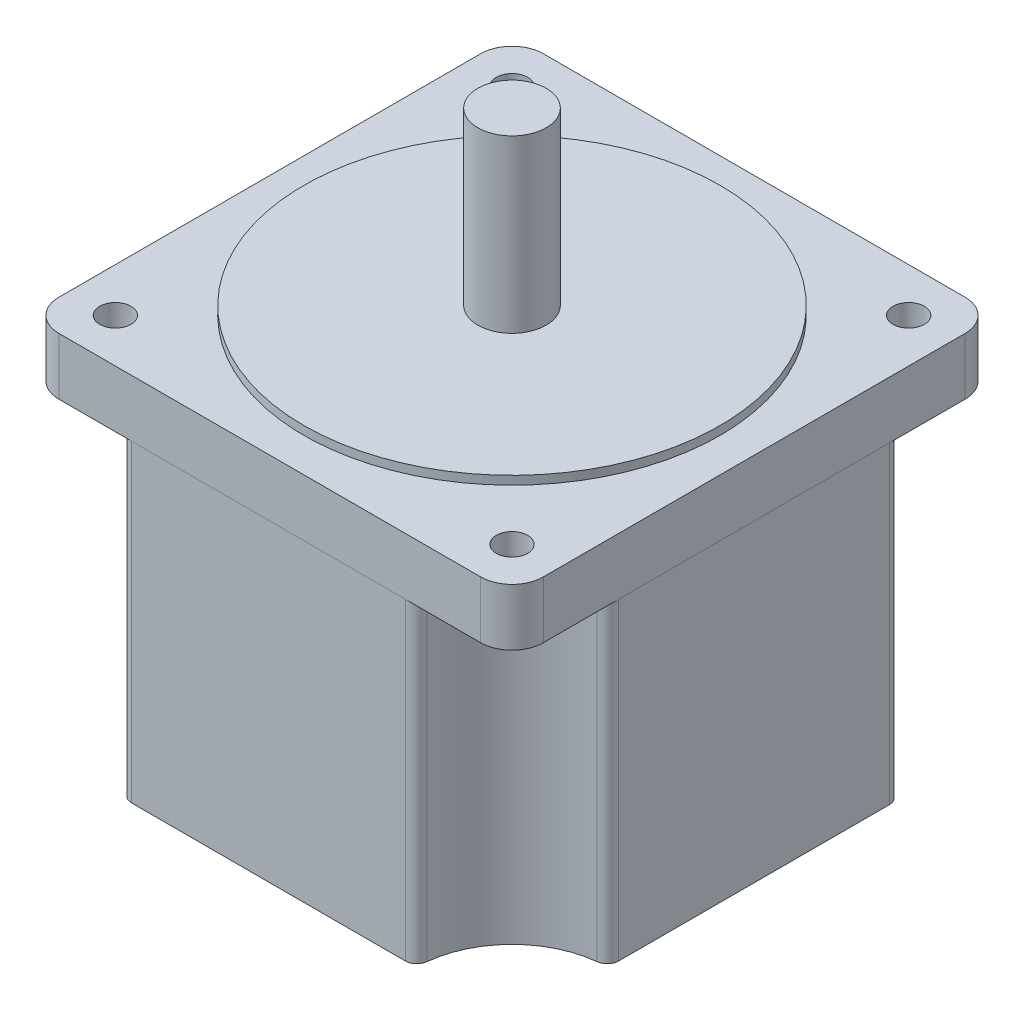
ISO-10303-21;
HEADER;
FILE_DESCRIPTION(('STEP AP214'),'2;1');
FILE_NAME('part.step','',(''),(''),'','','');
FILE_SCHEMA(('AUTOMOTIVE_DESIGN { 1 0 10303 214 1 1 1 1 }'));
ENDSEC;
DATA;
#1=APPLICATION_CONTEXT('core data for automotive mechanical design processes');
#2=APPLICATION_PROTOCOL_DEFINITION('international standard','automotive_design',2000,#1);
#3=PRODUCT_CONTEXT('',#1,'mechanical');
#4=PRODUCT('Part','Part','',(#3));
#5=PRODUCT_RELATED_PRODUCT_CATEGORY('part','',(#4));
#6=PRODUCT_DEFINITION_FORMATION('','',#4);
#7=PRODUCT_DEFINITION_CONTEXT('part definition',#1,'design');
#8=PRODUCT_DEFINITION('design','',#6,#7);
#9=PRODUCT_DEFINITION_SHAPE('','',#8);
#10=(LENGTH_UNIT() NAMED_UNIT(*) SI_UNIT(.MILLI.,.METRE.));
#11=(NAMED_UNIT(*) PLANE_ANGLE_UNIT() SI_UNIT($,.RADIAN.));
#12=(NAMED_UNIT(*) SI_UNIT($,.STERADIAN.) SOLID_ANGLE_UNIT());
#13=UNCERTAINTY_MEASURE_WITH_UNIT(LENGTH_MEASURE(1.E-05),#10,'distance_accuracy_value','');
#14=(GEOMETRIC_REPRESENTATION_CONTEXT(3) GLOBAL_UNCERTAINTY_ASSIGNED_CONTEXT((#13)) GLOBAL_UNIT_ASSIGNED_CONTEXT((#10,
#11,#12)) REPRESENTATION_CONTEXT('',''));
#15=CARTESIAN_POINT('',(0.,0.,0.));
#16=DIRECTION('',(0.,0.,1.));
#17=DIRECTION('',(1.,0.,0.));
#18=AXIS2_PLACEMENT_3D('',#15,#16,#17);
#19=CARTESIAN_POINT('',(0.,11.5,0.));
#20=DIRECTION('',(0.,1.,0.));
#21=DIRECTION('',(0.,0.,1.));
#22=AXIS2_PLACEMENT_3D('',#19,#20,#21);
#23=PLANE('',#22);
#24=CARTESIAN_POINT('',(0.,11.5,0.));
#25=DIRECTION('',(0.,1.,0.));
#26=DIRECTION('',(0.,0.,1.));
#27=AXIS2_PLACEMENT_3D('',#24,#25,#26);
#28=CIRCLE('',#27,36.51);
#29=CARTESIAN_POINT('',(0.,11.5,36.51));
#30=VERTEX_POINT('',#29);
#31=EDGE_CURVE('E229',#30,#30,#28,.T.);
#32=ORIENTED_EDGE('',*,*,#31,.T.);
#33=EDGE_LOOP('',(#32));
#34=FACE_BOUND('',#33,.T.);
#35=CARTESIAN_POINT('',(0.,11.5,0.));
#36=DIRECTION('',(0.,1.,0.));
#37=DIRECTION('',(0.,0.,1.));
#38=AXIS2_PLACEMENT_3D('',#35,#36,#37);
#39=CIRCLE('',#38,6.);
#40=CARTESIAN_POINT('',(0.,11.5,6.));
#41=VERTEX_POINT('',#40);
#42=EDGE_CURVE('E219',#41,#41,#39,.T.);
#43=ORIENTED_EDGE('',*,*,#42,.F.);
#44=EDGE_LOOP('',(#43));
#45=FACE_BOUND('',#44,.T.);
#46=ADVANCED_FACE('F31',(#34,#45),#23,.T.);
#47=CARTESIAN_POINT('',(-37.,10.,-37.));
#48=DIRECTION('',(0.,-1.,0.));
#49=DIRECTION('',(0.,0.,-1.));
#50=AXIS2_PLACEMENT_3D('',#47,#48,#49);
#51=PLANE('',#50);
#52=CARTESIAN_POINT('',(-34.8,10.,34.8));
#53=DIRECTION('',(0.,1.,0.));
#54=DIRECTION('',(0.,0.,-1.));
#55=AXIS2_PLACEMENT_3D('',#52,#53,#54);
#56=CIRCLE('',#55,2.75);
#57=CARTESIAN_POINT('',(-34.8,10.,32.05));
#58=VERTEX_POINT('',#57);
#59=EDGE_CURVE('E234',#58,#58,#56,.T.);
#60=ORIENTED_EDGE('',*,*,#59,.F.);
#61=EDGE_LOOP('',(#60));
#62=FACE_BOUND('',#61,.T.);
#63=CARTESIAN_POINT('',(34.8,10.,-34.8));
#64=DIRECTION('',(0.,1.,0.));
#65=DIRECTION('',(0.,0.,-1.));
#66=AXIS2_PLACEMENT_3D('',#63,#64,#65);
#67=CIRCLE('',#66,2.75);
#68=CARTESIAN_POINT('',(34.8,10.,-37.55));
#69=VERTEX_POINT('',#68);
#70=EDGE_CURVE('E246',#69,#69,#67,.T.);
#71=ORIENTED_EDGE('',*,*,#70,.F.);
#72=EDGE_LOOP('',(#71));
#73=FACE_BOUND('',#72,.T.);
#74=CARTESIAN_POINT('',(-37.,10.,-37.));
#75=DIRECTION('',(0.,1.,0.));
#76=DIRECTION('',(0.,0.,-1.));
#77=AXIS2_PLACEMENT_3D('',#74,#75,#76);
#78=CIRCLE('',#77,5.5);
#79=CARTESIAN_POINT('',(-37.,10.,-42.5));
#80=VERTEX_POINT('',#79);
#81=CARTESIAN_POINT('',(-42.5,10.,-37.));
#82=VERTEX_POINT('',#81);
#83=EDGE_CURVE('E258',#80,#82,#78,.T.);
#84=ORIENTED_EDGE('',*,*,#83,.T.);
#85=DIRECTION('',(0.,0.,1.));
#86=VECTOR('',#85,1.);
#87=CARTESIAN_POINT('',(-42.5,10.,-37.));
#88=LINE('',#87,#86);
#89=CARTESIAN_POINT('',(-42.5,10.,37.));
#90=VERTEX_POINT('',#89);
#91=EDGE_CURVE('E261',#82,#90,#88,.T.);
#92=ORIENTED_EDGE('',*,*,#91,.T.);
#93=CARTESIAN_POINT('',(-37.,10.,37.));
#94=DIRECTION('',(0.,1.,0.));
#95=DIRECTION('',(0.,0.,1.));
#96=AXIS2_PLACEMENT_3D('',#93,#94,#95);
#97=CIRCLE('',#96,5.5);
#98=CARTESIAN_POINT('',(-37.,10.,42.5));
#99=VERTEX_POINT('',#98);
#100=EDGE_CURVE('E264',#90,#99,#97,.T.);
#101=ORIENTED_EDGE('',*,*,#100,.T.);
#102=DIRECTION('',(1.,0.,0.));
#103=VECTOR('',#102,1.);
#104=CARTESIAN_POINT('',(-37.,10.,42.5));
#105=LINE('',#104,#103);
#106=CARTESIAN_POINT('',(37.,10.,42.5));
#107=VERTEX_POINT('',#106);
#108=EDGE_CURVE('E266',#99,#107,#105,.T.);
#109=ORIENTED_EDGE('',*,*,#108,.T.);
#110=CARTESIAN_POINT('',(37.,10.,37.));
#111=DIRECTION('',(0.,1.,0.));
#112=DIRECTION('',(0.,0.,1.));
#113=AXIS2_PLACEMENT_3D('',#110,#111,#112);
#114=CIRCLE('',#113,5.5);
#115=CARTESIAN_POINT('',(42.5,10.,37.));
#116=VERTEX_POINT('',#115);
#117=EDGE_CURVE('E268',#107,#116,#114,.T.);
#118=ORIENTED_EDGE('',*,*,#117,.T.);
#119=DIRECTION('',(0.,0.,-1.));
#120=VECTOR('',#119,1.);
#121=CARTESIAN_POINT('',(42.5,10.,-37.));
#122=LINE('',#121,#120);
#123=CARTESIAN_POINT('',(42.5,10.,-37.));
#124=VERTEX_POINT('',#123);
#125=EDGE_CURVE('E270',#116,#124,#122,.T.);
#126=ORIENTED_EDGE('',*,*,#125,.T.);
#127=CARTESIAN_POINT('',(37.,10.,-37.));
#128=DIRECTION('',(0.,1.,0.));
#129=DIRECTION('',(0.,0.,1.));
#130=AXIS2_PLACEMENT_3D('',#127,#128,#129);
#131=CIRCLE('',#130,5.5);
#132=CARTESIAN_POINT('',(37.,10.,-42.5));
#133=VERTEX_POINT('',#132);
#134=EDGE_CURVE('E272',#124,#133,#131,.T.);
#135=ORIENTED_EDGE('',*,*,#134,.T.);
#136=DIRECTION('',(-1.,0.,0.));
#137=VECTOR('',#136,1.);
#138=CARTESIAN_POINT('',(-37.,10.,-42.5));
#139=LINE('',#138,#137);
#140=EDGE_CURVE('E274',#133,#80,#139,.T.);
#141=ORIENTED_EDGE('',*,*,#140,.T.);
#142=EDGE_LOOP('',(#84,#92,#101,#109,#118,#126,#135,#141));
#143=FACE_BOUND('',#142,.T.);
#144=CARTESIAN_POINT('',(-34.8,10.,-34.8));
#145=DIRECTION('',(0.,1.,0.));
#146=DIRECTION('',(0.,0.,1.));
#147=AXIS2_PLACEMENT_3D('',#144,#145,#146);
#148=CIRCLE('',#147,2.75);
#149=CARTESIAN_POINT('',(-34.8,10.,-32.05));
#150=VERTEX_POINT('',#149);
#151=EDGE_CURVE('E252',#150,#150,#148,.T.);
#152=ORIENTED_EDGE('',*,*,#151,.F.);
#153=EDGE_LOOP('',(#152));
#154=FACE_BOUND('',#153,.T.);
#155=CARTESIAN_POINT('',(34.8,10.,34.8));
#156=DIRECTION('',(0.,1.,0.));
#157=DIRECTION('',(0.,0.,1.));
#158=AXIS2_PLACEMENT_3D('',#155,#156,#157);
#159=CIRCLE('',#158,2.75);
#160=CARTESIAN_POINT('',(34.8,10.,37.55));
#161=VERTEX_POINT('',#160);
#162=EDGE_CURVE('E240',#161,#161,#159,.T.);
#163=ORIENTED_EDGE('',*,*,#162,.F.);
#164=EDGE_LOOP('',(#163));
#165=FACE_BOUND('',#164,.T.);
#166=CARTESIAN_POINT('',(0.,10.,0.));
#167=DIRECTION('',(0.,-1.,0.));
#168=DIRECTION('',(0.,0.,-1.));
#169=AXIS2_PLACEMENT_3D('',#166,#167,#168);
#170=CIRCLE('',#169,36.51);
#171=CARTESIAN_POINT('',(0.,10.,-36.51));
#172=VERTEX_POINT('',#171);
#173=EDGE_CURVE('E35',#172,#172,#170,.F.);
#174=ORIENTED_EDGE('',*,*,#173,.F.);
#175=EDGE_LOOP('',(#174));
#176=FACE_BOUND('',#175,.T.);
#177=ADVANCED_FACE('F323',(#62,#73,#143,#154,#165,#176),#51,.F.);
#178=CARTESIAN_POINT('',(-37.,0.,-37.));
#179=DIRECTION('',(0.,-1.,0.));
#180=DIRECTION('',(0.,0.,-1.));
#181=AXIS2_PLACEMENT_3D('',#178,#179,#180);
#182=PLANE('',#181);
#183=CARTESIAN_POINT('',(-40.7551346354381,0.,-23.986897934833));
#184=DIRECTION('',(0.,-1.,0.));
#185=DIRECTION('',(0.,0.,1.));
#186=AXIS2_PLACEMENT_3D('',#183,#184,#185);
#187=CIRCLE('',#186,2.);
#188=CARTESIAN_POINT('',(-42.5,0.,-24.964366532565));
#189=VERTEX_POINT('',#188);
#190=CARTESIAN_POINT('',(-40.9702650079219,0.,-25.9752940027317));
#191=VERTEX_POINT('',#190);
#192=EDGE_CURVE('E11',#189,#191,#187,.T.);
#193=ORIENTED_EDGE('',*,*,#192,.F.);
#194=DIRECTION('',(0.,0.,1.));
#195=VECTOR('',#194,1.);
#196=CARTESIAN_POINT('',(-42.5,0.,-37.));
#197=LINE('',#196,#195);
#198=CARTESIAN_POINT('',(-42.5,0.,-37.));
#199=VERTEX_POINT('',#198);
#200=EDGE_CURVE('E280',#199,#189,#197,.T.);
#201=ORIENTED_EDGE('',*,*,#200,.F.);
#202=CARTESIAN_POINT('',(-37.,0.,-37.));
#203=DIRECTION('',(0.,1.,0.));
#204=DIRECTION('',(0.,0.,-1.));
#205=AXIS2_PLACEMENT_3D('',#202,#203,#204);
#206=CIRCLE('',#205,5.5);
#207=CARTESIAN_POINT('',(-37.,0.,-42.5));
#208=VERTEX_POINT('',#207);
#209=EDGE_CURVE('E255',#208,#199,#206,.T.);
#210=ORIENTED_EDGE('',*,*,#209,.F.);
#211=DIRECTION('',(-1.,0.,0.));
#212=VECTOR('',#211,1.);
#213=CARTESIAN_POINT('',(-37.,0.,-42.5));
#214=LINE('',#213,#212);
#215=CARTESIAN_POINT('',(37.,0.,-42.5));
#216=VERTEX_POINT('',#215);
#217=EDGE_CURVE('E262',#216,#208,#214,.T.);
#218=ORIENTED_EDGE('',*,*,#217,.F.);
#219=CARTESIAN_POINT('',(37.,0.,-37.));
#220=DIRECTION('',(0.,1.,0.));
#221=DIRECTION('',(0.,0.,1.));
#222=AXIS2_PLACEMENT_3D('',#219,#220,#221);
#223=CIRCLE('',#222,5.5);
#224=CARTESIAN_POINT('',(42.5,0.,-37.));
#225=VERTEX_POINT('',#224);
#226=EDGE_CURVE('E292',#225,#216,#223,.T.);
#227=ORIENTED_EDGE('',*,*,#226,.F.);
#228=DIRECTION('',(0.,0.,-1.));
#229=VECTOR('',#228,1.);
#230=CARTESIAN_POINT('',(42.5,0.,-37.));
#231=LINE('',#230,#229);
#232=CARTESIAN_POINT('',(42.5,0.,37.));
#233=VERTEX_POINT('',#232);
#234=EDGE_CURVE('E290',#233,#225,#231,.T.);
#235=ORIENTED_EDGE('',*,*,#234,.F.);
#236=CARTESIAN_POINT('',(37.,0.,37.));
#237=DIRECTION('',(0.,1.,0.));
#238=DIRECTION('',(0.,0.,1.));
#239=AXIS2_PLACEMENT_3D('',#236,#237,#238);
#240=CIRCLE('',#239,5.5);
#241=CARTESIAN_POINT('',(37.,0.,42.5));
#242=VERTEX_POINT('',#241);
#243=EDGE_CURVE('E288',#242,#233,#240,.T.);
#244=ORIENTED_EDGE('',*,*,#243,.F.);
#245=DIRECTION('',(1.,0.,0.));
#246=VECTOR('',#245,1.);
#247=CARTESIAN_POINT('',(-37.,0.,42.5));
#248=LINE('',#247,#246);
#249=CARTESIAN_POINT('',(-37.,0.,42.5));
#250=VERTEX_POINT('',#249);
#251=EDGE_CURVE('E286',#250,#242,#248,.T.);
#252=ORIENTED_EDGE('',*,*,#251,.F.);
#253=CARTESIAN_POINT('',(-37.,0.,37.));
#254=DIRECTION('',(0.,1.,0.));
#255=DIRECTION('',(0.,0.,1.));
#256=AXIS2_PLACEMENT_3D('',#253,#254,#255);
#257=CIRCLE('',#256,5.5);
#258=CARTESIAN_POINT('',(-42.5,0.,37.));
#259=VERTEX_POINT('',#258);
#260=EDGE_CURVE('E283',#259,#250,#257,.T.);
#261=ORIENTED_EDGE('',*,*,#260,.F.);
#262=CARTESIAN_POINT('',(-42.5,0.,24.9643665325649));
#263=VERTEX_POINT('',#262);
#264=EDGE_CURVE('E279',#263,#259,#197,.T.);
#265=ORIENTED_EDGE('',*,*,#264,.F.);
#266=CARTESIAN_POINT('',(-40.7551346354381,0.,23.986897934833));
#267=DIRECTION('',(0.,-1.,0.));
#268=DIRECTION('',(0.,0.,-1.));
#269=AXIS2_PLACEMENT_3D('',#266,#267,#268);
#270=CIRCLE('',#269,2.);
#271=CARTESIAN_POINT('',(-40.9702650079219,0.,25.9752940027317));
#272=VERTEX_POINT('',#271);
#273=EDGE_CURVE('E394',#272,#263,#270,.T.);
#274=ORIENTED_EDGE('',*,*,#273,.F.);
#275=CARTESIAN_POINT('',(-42.755134635438,0.,42.4723962393402));
#276=DIRECTION('',(0.,1.,0.));
#277=DIRECTION('',(0.,0.,1.));
#278=AXIS2_PLACEMENT_3D('',#275,#276,#277);
#279=CIRCLE('',#278,16.5933764433988);
#280=CARTESIAN_POINT('',(-26.2580323988295,0.,40.6875266118239));
#281=VERTEX_POINT('',#280);
#282=EDGE_CURVE('E472',#281,#272,#279,.T.);
#283=ORIENTED_EDGE('',*,*,#282,.F.);
#284=CARTESIAN_POINT('',(-24.2696363309308,0.,40.4723962393401));
#285=DIRECTION('',(0.,-1.,0.));
#286=DIRECTION('',(0.,0.,-1.));
#287=AXIS2_PLACEMENT_3D('',#284,#285,#286);
#288=CIRCLE('',#287,2.);
#289=CARTESIAN_POINT('',(-24.2696363309308,0.,42.4723962393401));
#290=VERTEX_POINT('',#289);
#291=EDGE_CURVE('E469',#290,#281,#288,.T.);
#292=ORIENTED_EDGE('',*,*,#291,.F.);
#293=DIRECTION('',(-1.,0.,0.));
#294=VECTOR('',#293,1.);
#295=CARTESIAN_POINT('',(-24.2696363309308,0.,42.4723962393401));
#296=LINE('',#295,#294);
#297=CARTESIAN_POINT('',(23.7593670600548,0.,42.4723962393401));
#298=VERTEX_POINT('',#297);
#299=EDGE_CURVE('E466',#298,#290,#296,.T.);
#300=ORIENTED_EDGE('',*,*,#299,.F.);
#301=CARTESIAN_POINT('',(23.7593670600548,0.,40.4723962393401));
#302=DIRECTION('',(0.,-1.,0.));
#303=DIRECTION('',(0.,0.,-1.));
#304=AXIS2_PLACEMENT_3D('',#301,#302,#303);
#305=CIRCLE('',#304,2.);
#306=CARTESIAN_POINT('',(25.7477631279535,0.,40.6875266118239));
#307=VERTEX_POINT('',#306);
#308=EDGE_CURVE('E463',#307,#298,#305,.T.);
#309=ORIENTED_EDGE('',*,*,#308,.F.);
#310=CARTESIAN_POINT('',(42.5,0.,42.5));
#311=DIRECTION('',(0.,1.,0.));
#312=DIRECTION('',(0.,0.,1.));
#313=AXIS2_PLACEMENT_3D('',#310,#311,#312);
#314=CIRCLE('',#313,16.85);
#315=CARTESIAN_POINT('',(40.6875266118239,0.,25.7477631279535));
#316=VERTEX_POINT('',#315);
#317=EDGE_CURVE('E460',#316,#307,#314,.T.);
#318=ORIENTED_EDGE('',*,*,#317,.F.);
#319=CARTESIAN_POINT('',(40.4723962393401,0.,23.7593670600548));
#320=DIRECTION('',(0.,-1.,0.));
#321=DIRECTION('',(0.,0.,-1.));
#322=AXIS2_PLACEMENT_3D('',#319,#320,#321);
#323=CIRCLE('',#322,2.);
#324=CARTESIAN_POINT('',(42.4723962393401,0.,23.7593670600548));
#325=VERTEX_POINT('',#324);
#326=EDGE_CURVE('E457',#325,#316,#323,.T.);
#327=ORIENTED_EDGE('',*,*,#326,.F.);
#328=DIRECTION('',(0.,0.,1.));
#329=VECTOR('',#328,1.);
#330=CARTESIAN_POINT('',(42.4723962393401,0.,23.7593670600548));
#331=LINE('',#330,#329);
#332=CARTESIAN_POINT('',(42.4723962393401,0.,-23.7593670600548));
#333=VERTEX_POINT('',#332);
#334=EDGE_CURVE('E454',#333,#325,#331,.T.);
#335=ORIENTED_EDGE('',*,*,#334,.F.);
#336=CARTESIAN_POINT('',(40.4723962393401,0.,-23.7593670600548));
#337=DIRECTION('',(0.,-1.,0.));
#338=DIRECTION('',(0.,0.,-1.));
#339=AXIS2_PLACEMENT_3D('',#336,#337,#338);
#340=CIRCLE('',#339,2.);
#341=CARTESIAN_POINT('',(40.6875266118239,0.,-25.7477631279535));
#342=VERTEX_POINT('',#341);
#343=EDGE_CURVE('E447',#342,#333,#340,.T.);
#344=ORIENTED_EDGE('',*,*,#343,.F.);
#345=CARTESIAN_POINT('',(42.5,0.,-42.5));
#346=DIRECTION('',(0.,1.,0.));
#347=DIRECTION('',(0.,0.,-1.));
#348=AXIS2_PLACEMENT_3D('',#345,#346,#347);
#349=CIRCLE('',#348,16.85);
#350=CARTESIAN_POINT('',(25.7477631279535,0.,-40.6875266118239));
#351=VERTEX_POINT('',#350);
#352=EDGE_CURVE('E439',#351,#342,#349,.T.);
#353=ORIENTED_EDGE('',*,*,#352,.F.);
#354=CARTESIAN_POINT('',(23.7593670600548,0.,-40.4723962393401));
#355=DIRECTION('',(0.,-1.,0.));
#356=DIRECTION('',(0.,0.,-1.));
#357=AXIS2_PLACEMENT_3D('',#354,#355,#356);
#358=CIRCLE('',#357,2.);
#359=CARTESIAN_POINT('',(23.7593670600548,0.,-42.4723962393401));
#360=VERTEX_POINT('',#359);
#361=EDGE_CURVE('E444',#360,#351,#358,.T.);
#362=ORIENTED_EDGE('',*,*,#361,.F.);
#363=DIRECTION('',(1.,0.,0.));
#364=VECTOR('',#363,1.);
#365=CARTESIAN_POINT('',(23.7593670600548,0.,-42.4723962393401));
#366=LINE('',#365,#364);
#367=CARTESIAN_POINT('',(-24.2696363309308,0.,-42.4723962393401));
#368=VERTEX_POINT('',#367);
#369=EDGE_CURVE('E445',#368,#360,#366,.T.);
#370=ORIENTED_EDGE('',*,*,#369,.F.);
#371=CARTESIAN_POINT('',(-24.2696363309308,0.,-40.4723962393401));
#372=DIRECTION('',(0.,-1.,0.));
#373=DIRECTION('',(0.,0.,1.));
#374=AXIS2_PLACEMENT_3D('',#371,#372,#373);
#375=CIRCLE('',#374,2.);
#376=CARTESIAN_POINT('',(-26.2580323988295,0.,-40.6875266118239));
#377=VERTEX_POINT('',#376);
#378=EDGE_CURVE('E52',#377,#368,#375,.T.);
#379=ORIENTED_EDGE('',*,*,#378,.F.);
#380=CARTESIAN_POINT('',(-42.755134635438,0.,-42.4723962393402));
#381=DIRECTION('',(0.,1.,0.));
#382=DIRECTION('',(0.,0.,-1.));
#383=AXIS2_PLACEMENT_3D('',#380,#381,#382);
#384=CIRCLE('',#383,16.5933764433988);
#385=EDGE_CURVE('E48',#191,#377,#384,.T.);
#386=ORIENTED_EDGE('',*,*,#385,.F.);
#387=EDGE_LOOP('',(#193,#201,#210,#218,#227,#235,#244,#252,#261,#265,#274,#283,#292,#300,#309,
#318,#327,#335,#344,#353,#362,#370,#379,#386));
#388=FACE_BOUND('',#387,.T.);
#389=CARTESIAN_POINT('',(34.8,0.,34.8));
#390=DIRECTION('',(0.,1.,0.));
#391=DIRECTION('',(0.,0.,1.));
#392=AXIS2_PLACEMENT_3D('',#389,#390,#391);
#393=CIRCLE('',#392,2.75);
#394=CARTESIAN_POINT('',(34.8,0.,37.55));
#395=VERTEX_POINT('',#394);
#396=EDGE_CURVE('E237',#395,#395,#393,.T.);
#397=ORIENTED_EDGE('',*,*,#396,.T.);
#398=EDGE_LOOP('',(#397));
#399=FACE_BOUND('',#398,.T.);
#400=CARTESIAN_POINT('',(-34.8,0.,-34.8));
#401=DIRECTION('',(0.,1.,0.));
#402=DIRECTION('',(0.,0.,1.));
#403=AXIS2_PLACEMENT_3D('',#400,#401,#402);
#404=CIRCLE('',#403,2.75);
#405=CARTESIAN_POINT('',(-34.8,0.,-32.05));
#406=VERTEX_POINT('',#405);
#407=EDGE_CURVE('E249',#406,#406,#404,.T.);
#408=ORIENTED_EDGE('',*,*,#407,.T.);
#409=EDGE_LOOP('',(#408));
#410=FACE_BOUND('',#409,.T.);
#411=CARTESIAN_POINT('',(34.8,0.,-34.8));
#412=DIRECTION('',(0.,1.,0.));
#413=DIRECTION('',(0.,0.,-1.));
#414=AXIS2_PLACEMENT_3D('',#411,#412,#413);
#415=CIRCLE('',#414,2.75);
#416=CARTESIAN_POINT('',(34.8,0.,-37.55));
#417=VERTEX_POINT('',#416);
#418=EDGE_CURVE('E243',#417,#417,#415,.T.);
#419=ORIENTED_EDGE('',*,*,#418,.T.);
#420=EDGE_LOOP('',(#419));
#421=FACE_BOUND('',#420,.T.);
#422=CARTESIAN_POINT('',(-34.8,0.,34.8));
#423=DIRECTION('',(0.,1.,0.));
#424=DIRECTION('',(0.,0.,-1.));
#425=AXIS2_PLACEMENT_3D('',#422,#423,#424);
#426=CIRCLE('',#425,2.75);
#427=CARTESIAN_POINT('',(-34.8,0.,32.05));
#428=VERTEX_POINT('',#427);
#429=EDGE_CURVE('E233',#428,#428,#426,.T.);
#430=ORIENTED_EDGE('',*,*,#429,.T.);
#431=EDGE_LOOP('',(#430));
#432=FACE_BOUND('',#431,.T.);
#433=ADVANCED_FACE('F325',(#388,#399,#410,#421,#432),#182,.T.);
#434=CARTESIAN_POINT('',(-37.,10.,-37.));
#435=DIRECTION('',(0.,-1.,0.));
#436=DIRECTION('',(0.,0.,-1.));
#437=AXIS2_PLACEMENT_3D('',#434,#435,#436);
#438=CYLINDRICAL_SURFACE('',#437,5.5);
#439=ORIENTED_EDGE('',*,*,#209,.T.);
#440=DIRECTION('',(0.,-1.,0.));
#441=VECTOR('',#440,1.);
#442=CARTESIAN_POINT('',(-42.5,10.,-37.));
#443=LINE('',#442,#441);
#444=EDGE_CURVE('E314',#82,#199,#443,.T.);
#445=ORIENTED_EDGE('',*,*,#444,.F.);
#446=ORIENTED_EDGE('',*,*,#83,.F.);
#447=DIRECTION('',(0.,-1.,0.));
#448=VECTOR('',#447,1.);
#449=CARTESIAN_POINT('',(-37.,10.,-42.5));
#450=LINE('',#449,#448);
#451=EDGE_CURVE('E276',#80,#208,#450,.T.);
#452=ORIENTED_EDGE('',*,*,#451,.T.);
#453=EDGE_LOOP('',(#439,#445,#446,#452));
#454=FACE_BOUND('',#453,.T.);
#455=ADVANCED_FACE('F33',(#454),#438,.T.);
#456=CARTESIAN_POINT('',(-42.5,10.,-37.));
#457=DIRECTION('',(1.,0.,0.));
#458=DIRECTION('',(0.,0.,-1.));
#459=AXIS2_PLACEMENT_3D('',#456,#457,#458);
#460=PLANE('',#459);
#461=ORIENTED_EDGE('',*,*,#200,.T.);
#462=EDGE_CURVE('E284',#189,#263,#197,.T.);
#463=ORIENTED_EDGE('',*,*,#462,.T.);
#464=ORIENTED_EDGE('',*,*,#264,.T.);
#465=DIRECTION('',(0.,-1.,0.));
#466=VECTOR('',#465,1.);
#467=CARTESIAN_POINT('',(-42.5,10.,37.));
#468=LINE('',#467,#466);
#469=EDGE_CURVE('E312',#90,#259,#468,.T.);
#470=ORIENTED_EDGE('',*,*,#469,.F.);
#471=ORIENTED_EDGE('',*,*,#91,.F.);
#472=ORIENTED_EDGE('',*,*,#444,.T.);
#473=EDGE_LOOP('',(#461,#463,#464,#470,#471,#472));
#474=FACE_BOUND('',#473,.T.);
#475=ADVANCED_FACE('F365',(#474),#460,.F.);
#476=CARTESIAN_POINT('',(-37.,10.,37.));
#477=DIRECTION('',(0.,-1.,0.));
#478=DIRECTION('',(0.,0.,-1.));
#479=AXIS2_PLACEMENT_3D('',#476,#477,#478);
#480=CYLINDRICAL_SURFACE('',#479,5.5);
#481=ORIENTED_EDGE('',*,*,#260,.T.);
#482=DIRECTION('',(0.,-1.,0.));
#483=VECTOR('',#482,1.);
#484=CARTESIAN_POINT('',(-37.,10.,42.5));
#485=LINE('',#484,#483);
#486=EDGE_CURVE('E309',#99,#250,#485,.T.);
#487=ORIENTED_EDGE('',*,*,#486,.F.);
#488=ORIENTED_EDGE('',*,*,#100,.F.);
#489=ORIENTED_EDGE('',*,*,#469,.T.);
#490=EDGE_LOOP('',(#481,#487,#488,#489));
#491=FACE_BOUND('',#490,.T.);
#492=ADVANCED_FACE('F362',(#491),#480,.T.);
#493=CARTESIAN_POINT('',(-37.,10.,42.5));
#494=DIRECTION('',(0.,0.,-1.));
#495=DIRECTION('',(-1.,0.,0.));
#496=AXIS2_PLACEMENT_3D('',#493,#494,#495);
#497=PLANE('',#496);
#498=ORIENTED_EDGE('',*,*,#251,.T.);
#499=DIRECTION('',(0.,-1.,0.));
#500=VECTOR('',#499,1.);
#501=CARTESIAN_POINT('',(37.,10.,42.5));
#502=LINE('',#501,#500);
#503=EDGE_CURVE('E306',#107,#242,#502,.T.);
#504=ORIENTED_EDGE('',*,*,#503,.F.);
#505=ORIENTED_EDGE('',*,*,#108,.F.);
#506=ORIENTED_EDGE('',*,*,#486,.T.);
#507=EDGE_LOOP('',(#498,#504,#505,#506));
#508=FACE_BOUND('',#507,.T.);
#509=ADVANCED_FACE('F358',(#508),#497,.F.);
#510=CARTESIAN_POINT('',(37.,10.,37.));
#511=DIRECTION('',(0.,-1.,0.));
#512=DIRECTION('',(0.,0.,-1.));
#513=AXIS2_PLACEMENT_3D('',#510,#511,#512);
#514=CYLINDRICAL_SURFACE('',#513,5.5);
#515=ORIENTED_EDGE('',*,*,#243,.T.);
#516=DIRECTION('',(0.,-1.,0.));
#517=VECTOR('',#516,1.);
#518=CARTESIAN_POINT('',(42.5,10.,37.));
#519=LINE('',#518,#517);
#520=EDGE_CURVE('E303',#116,#233,#519,.T.);
#521=ORIENTED_EDGE('',*,*,#520,.F.);
#522=ORIENTED_EDGE('',*,*,#117,.F.);
#523=ORIENTED_EDGE('',*,*,#503,.T.);
#524=EDGE_LOOP('',(#515,#521,#522,#523));
#525=FACE_BOUND('',#524,.T.);
#526=ADVANCED_FACE('F354',(#525),#514,.T.);
#527=CARTESIAN_POINT('',(42.5,10.,-37.));
#528=DIRECTION('',(-1.,0.,0.));
#529=DIRECTION('',(0.,0.,1.));
#530=AXIS2_PLACEMENT_3D('',#527,#528,#529);
#531=PLANE('',#530);
#532=ORIENTED_EDGE('',*,*,#234,.T.);
#533=DIRECTION('',(0.,-1.,0.));
#534=VECTOR('',#533,1.);
#535=CARTESIAN_POINT('',(42.5,10.,-37.));
#536=LINE('',#535,#534);
#537=EDGE_CURVE('E300',#124,#225,#536,.T.);
#538=ORIENTED_EDGE('',*,*,#537,.F.);
#539=ORIENTED_EDGE('',*,*,#125,.F.);
#540=ORIENTED_EDGE('',*,*,#520,.T.);
#541=EDGE_LOOP('',(#532,#538,#539,#540));
#542=FACE_BOUND('',#541,.T.);
#543=ADVANCED_FACE('F350',(#542),#531,.F.);
#544=CARTESIAN_POINT('',(37.,10.,-37.));
#545=DIRECTION('',(0.,-1.,0.));
#546=DIRECTION('',(0.,0.,-1.));
#547=AXIS2_PLACEMENT_3D('',#544,#545,#546);
#548=CYLINDRICAL_SURFACE('',#547,5.5);
#549=ORIENTED_EDGE('',*,*,#226,.T.);
#550=DIRECTION('',(0.,-1.,0.));
#551=VECTOR('',#550,1.);
#552=CARTESIAN_POINT('',(37.,10.,-42.5));
#553=LINE('',#552,#551);
#554=EDGE_CURVE('E297',#133,#216,#553,.T.);
#555=ORIENTED_EDGE('',*,*,#554,.F.);
#556=ORIENTED_EDGE('',*,*,#134,.F.);
#557=ORIENTED_EDGE('',*,*,#537,.T.);
#558=EDGE_LOOP('',(#549,#555,#556,#557));
#559=FACE_BOUND('',#558,.T.);
#560=ADVANCED_FACE('F346',(#559),#548,.T.);
#561=CARTESIAN_POINT('',(-37.,10.,-42.5));
#562=DIRECTION('',(0.,0.,1.));
#563=DIRECTION('',(1.,0.,0.));
#564=AXIS2_PLACEMENT_3D('',#561,#562,#563);
#565=PLANE('',#564);
#566=ORIENTED_EDGE('',*,*,#217,.T.);
#567=ORIENTED_EDGE('',*,*,#451,.F.);
#568=ORIENTED_EDGE('',*,*,#140,.F.);
#569=ORIENTED_EDGE('',*,*,#554,.T.);
#570=EDGE_LOOP('',(#566,#567,#568,#569));
#571=FACE_BOUND('',#570,.T.);
#572=ADVANCED_FACE('F343',(#571),#565,.F.);
#573=CARTESIAN_POINT('',(-34.8,10.,-34.8));
#574=DIRECTION('',(0.,-1.,0.));
#575=DIRECTION('',(0.,0.,-1.));
#576=AXIS2_PLACEMENT_3D('',#573,#574,#575);
#577=CYLINDRICAL_SURFACE('',#576,2.75);
#578=ORIENTED_EDGE('',*,*,#151,.T.);
#579=EDGE_LOOP('',(#578));
#580=FACE_BOUND('',#579,.T.);
#581=ORIENTED_EDGE('',*,*,#407,.F.);
#582=EDGE_LOOP('',(#581));
#583=FACE_BOUND('',#582,.T.);
#584=ADVANCED_FACE('F340',(#580,#583),#577,.F.);
#585=CARTESIAN_POINT('',(34.8,10.,-34.8));
#586=DIRECTION('',(0.,-1.,0.));
#587=DIRECTION('',(0.,0.,-1.));
#588=AXIS2_PLACEMENT_3D('',#585,#586,#587);
#589=CYLINDRICAL_SURFACE('',#588,2.75);
#590=ORIENTED_EDGE('',*,*,#70,.T.);
#591=EDGE_LOOP('',(#590));
#592=FACE_BOUND('',#591,.T.);
#593=ORIENTED_EDGE('',*,*,#418,.F.);
#594=EDGE_LOOP('',(#593));
#595=FACE_BOUND('',#594,.T.);
#596=ADVANCED_FACE('F569',(#592,#595),#589,.F.);
#597=CARTESIAN_POINT('',(34.8,10.,34.8));
#598=DIRECTION('',(0.,-1.,0.));
#599=DIRECTION('',(0.,0.,-1.));
#600=AXIS2_PLACEMENT_3D('',#597,#598,#599);
#601=CYLINDRICAL_SURFACE('',#600,2.75);
#602=ORIENTED_EDGE('',*,*,#162,.T.);
#603=EDGE_LOOP('',(#602));
#604=FACE_BOUND('',#603,.T.);
#605=ORIENTED_EDGE('',*,*,#396,.F.);
#606=EDGE_LOOP('',(#605));
#607=FACE_BOUND('',#606,.T.);
#608=ADVANCED_FACE('F565',(#604,#607),#601,.F.);
#609=CARTESIAN_POINT('',(-34.8,10.,34.8));
#610=DIRECTION('',(0.,-1.,0.));
#611=DIRECTION('',(0.,0.,-1.));
#612=AXIS2_PLACEMENT_3D('',#609,#610,#611);
#613=CYLINDRICAL_SURFACE('',#612,2.75);
#614=ORIENTED_EDGE('',*,*,#59,.T.);
#615=EDGE_LOOP('',(#614));
#616=FACE_BOUND('',#615,.T.);
#617=ORIENTED_EDGE('',*,*,#429,.F.);
#618=EDGE_LOOP('',(#617));
#619=FACE_BOUND('',#618,.T.);
#620=ADVANCED_FACE('F568',(#616,#619),#613,.F.);
#621=CARTESIAN_POINT('',(0.,11.5,0.));
#622=DIRECTION('',(0.,-1.,0.));
#623=DIRECTION('',(0.,0.,-1.));
#624=AXIS2_PLACEMENT_3D('',#621,#622,#623);
#625=CYLINDRICAL_SURFACE('',#624,36.51);
#626=ORIENTED_EDGE('',*,*,#31,.F.);
#627=EDGE_LOOP('',(#626));
#628=FACE_BOUND('',#627,.T.);
#629=ORIENTED_EDGE('',*,*,#173,.T.);
#630=EDGE_LOOP('',(#629));
#631=FACE_BOUND('',#630,.T.);
#632=ADVANCED_FACE('F321',(#628,#631),#625,.T.);
#633=CARTESIAN_POINT('',(0.,41.5,0.));
#634=DIRECTION('',(0.,-1.,0.));
#635=DIRECTION('',(0.,0.,-1.));
#636=AXIS2_PLACEMENT_3D('',#633,#634,#635);
#637=CYLINDRICAL_SURFACE('',#636,6.);
#638=CARTESIAN_POINT('',(0.,41.5,0.));
#639=DIRECTION('',(0.,1.,0.));
#640=DIRECTION('',(0.,0.,1.));
#641=AXIS2_PLACEMENT_3D('',#638,#639,#640);
#642=CIRCLE('',#641,6.);
#643=CARTESIAN_POINT('',(0.,41.5,6.));
#644=VERTEX_POINT('',#643);
#645=EDGE_CURVE('E222',#644,#644,#642,.T.);
#646=ORIENTED_EDGE('',*,*,#645,.F.);
#647=EDGE_LOOP('',(#646));
#648=FACE_BOUND('',#647,.T.);
#649=ORIENTED_EDGE('',*,*,#42,.T.);
#650=EDGE_LOOP('',(#649));
#651=FACE_BOUND('',#650,.T.);
#652=ADVANCED_FACE('F585',(#648,#651),#637,.T.);
#653=CARTESIAN_POINT('',(0.,41.5,0.));
#654=DIRECTION('',(0.,1.,0.));
#655=DIRECTION('',(0.,0.,1.));
#656=AXIS2_PLACEMENT_3D('',#653,#654,#655);
#657=PLANE('',#656);
#658=ORIENTED_EDGE('',*,*,#645,.T.);
#659=EDGE_LOOP('',(#658));
#660=FACE_BOUND('',#659,.T.);
#661=ADVANCED_FACE('F640',(#660),#657,.T.);
#662=CARTESIAN_POINT('',(-24.2696363309308,0.,-40.4723962393401));
#663=DIRECTION('',(0.,1.,0.));
#664=DIRECTION('',(0.,0.,1.));
#665=AXIS2_PLACEMENT_3D('',#662,#663,#664);
#666=PLANE('',#665);
#667=ORIENTED_EDGE('',*,*,#462,.F.);
#668=CARTESIAN_POINT('',(-42.7551346354381,0.,-23.986897934833));
#669=VERTEX_POINT('',#668);
#670=EDGE_CURVE('E41',#669,#189,#187,.T.);
#671=ORIENTED_EDGE('',*,*,#670,.F.);
#672=DIRECTION('',(0.,0.,-1.));
#673=VECTOR('',#672,1.);
#674=CARTESIAN_POINT('',(-42.7551346354381,0.,23.986897934833));
#675=LINE('',#674,#673);
#676=CARTESIAN_POINT('',(-42.7551346354381,0.,23.986897934833));
#677=VERTEX_POINT('',#676);
#678=EDGE_CURVE('E392',#677,#669,#675,.T.);
#679=ORIENTED_EDGE('',*,*,#678,.F.);
#680=EDGE_CURVE('E382',#263,#677,#270,.T.);
#681=ORIENTED_EDGE('',*,*,#680,.F.);
#682=EDGE_LOOP('',(#667,#671,#679,#681));
#683=FACE_BOUND('',#682,.T.);
#684=ADVANCED_FACE('F380',(#683),#666,.T.);
#685=CARTESIAN_POINT('',(-24.2696363309308,-55.,-40.4723962393401));
#686=DIRECTION('',(0.,1.,0.));
#687=DIRECTION('',(0.,0.,1.));
#688=AXIS2_PLACEMENT_3D('',#685,#686,#687);
#689=CYLINDRICAL_SURFACE('',#688,2.);
#690=ORIENTED_EDGE('',*,*,#378,.T.);
#691=DIRECTION('',(0.,1.,0.));
#692=VECTOR('',#691,1.);
#693=CARTESIAN_POINT('',(-24.2696363309308,-55.,-42.4723962393401));
#694=LINE('',#693,#692);
#695=CARTESIAN_POINT('',(-24.2696363309308,-55.,-42.4723962393401));
#696=VERTEX_POINT('',#695);
#697=EDGE_CURVE('E202',#696,#368,#694,.T.);
#698=ORIENTED_EDGE('',*,*,#697,.F.);
#699=CARTESIAN_POINT('',(-24.2696363309308,-55.,-40.4723962393401));
#700=DIRECTION('',(0.,-1.,0.));
#701=DIRECTION('',(0.,0.,1.));
#702=AXIS2_PLACEMENT_3D('',#699,#700,#701);
#703=CIRCLE('',#702,2.);
#704=CARTESIAN_POINT('',(-26.2580323988295,-55.,-40.6875266118239));
#705=VERTEX_POINT('',#704);
#706=EDGE_CURVE('E208',#705,#696,#703,.T.);
#707=ORIENTED_EDGE('',*,*,#706,.F.);
#708=DIRECTION('',(0.,1.,0.));
#709=VECTOR('',#708,1.);
#710=CARTESIAN_POINT('',(-26.2580323988295,-55.,-40.6875266118239));
#711=LINE('',#710,#709);
#712=EDGE_CURVE('E398',#705,#377,#711,.T.);
#713=ORIENTED_EDGE('',*,*,#712,.T.);
#714=EDGE_LOOP('',(#690,#698,#707,#713));
#715=FACE_BOUND('',#714,.T.);
#716=ADVANCED_FACE('F218',(#715),#689,.T.);
#717=CARTESIAN_POINT('',(23.7593670600548,-55.,-42.4723962393401));
#718=DIRECTION('',(0.,0.,1.));
#719=DIRECTION('',(1.,0.,0.));
#720=AXIS2_PLACEMENT_3D('',#717,#718,#719);
#721=PLANE('',#720);
#722=ORIENTED_EDGE('',*,*,#369,.T.);
#723=DIRECTION('',(0.,1.,0.));
#724=VECTOR('',#723,1.);
#725=CARTESIAN_POINT('',(23.7593670600548,-55.,-42.4723962393401));
#726=LINE('',#725,#724);
#727=CARTESIAN_POINT('',(23.7593670600548,-55.,-42.4723962393401));
#728=VERTEX_POINT('',#727);
#729=EDGE_CURVE('E204',#728,#360,#726,.T.);
#730=ORIENTED_EDGE('',*,*,#729,.F.);
#731=DIRECTION('',(1.,0.,0.));
#732=VECTOR('',#731,1.);
#733=CARTESIAN_POINT('',(23.7593670600548,-55.,-42.4723962393401));
#734=LINE('',#733,#732);
#735=EDGE_CURVE('E197',#696,#728,#734,.T.);
#736=ORIENTED_EDGE('',*,*,#735,.F.);
#737=ORIENTED_EDGE('',*,*,#697,.T.);
#738=EDGE_LOOP('',(#722,#730,#736,#737));
#739=FACE_BOUND('',#738,.T.);
#740=ADVANCED_FACE('F200',(#739),#721,.F.);
#741=CARTESIAN_POINT('',(23.7593670600548,-55.,-40.4723962393401));
#742=DIRECTION('',(0.,1.,0.));
#743=DIRECTION('',(0.,0.,1.));
#744=AXIS2_PLACEMENT_3D('',#741,#742,#743);
#745=CYLINDRICAL_SURFACE('',#744,2.);
#746=ORIENTED_EDGE('',*,*,#361,.T.);
#747=DIRECTION('',(0.,1.,0.));
#748=VECTOR('',#747,1.);
#749=CARTESIAN_POINT('',(25.7477631279535,-55.,-40.6875266118239));
#750=LINE('',#749,#748);
#751=CARTESIAN_POINT('',(25.7477631279535,-55.,-40.6875266118239));
#752=VERTEX_POINT('',#751);
#753=EDGE_CURVE('E224',#752,#351,#750,.T.);
#754=ORIENTED_EDGE('',*,*,#753,.F.);
#755=CARTESIAN_POINT('',(23.7593670600548,-55.,-40.4723962393401));
#756=DIRECTION('',(0.,-1.,0.));
#757=DIRECTION('',(0.,0.,-1.));
#758=AXIS2_PLACEMENT_3D('',#755,#756,#757);
#759=CIRCLE('',#758,2.);
#760=EDGE_CURVE('E207',#728,#752,#759,.T.);
#761=ORIENTED_EDGE('',*,*,#760,.F.);
#762=ORIENTED_EDGE('',*,*,#729,.T.);
#763=EDGE_LOOP('',(#746,#754,#761,#762));
#764=FACE_BOUND('',#763,.T.);
#765=ADVANCED_FACE('F443',(#764),#745,.T.);
#766=CARTESIAN_POINT('',(42.5,-55.,-42.5));
#767=DIRECTION('',(0.,1.,0.));
#768=DIRECTION('',(0.,0.,1.));
#769=AXIS2_PLACEMENT_3D('',#766,#767,#768);
#770=CYLINDRICAL_SURFACE('',#769,16.85);
#771=ORIENTED_EDGE('',*,*,#352,.T.);
#772=DIRECTION('',(0.,1.,0.));
#773=VECTOR('',#772,1.);
#774=CARTESIAN_POINT('',(40.6875266118239,-55.,-25.7477631279535));
#775=LINE('',#774,#773);
#776=CARTESIAN_POINT('',(40.6875266118239,-55.,-25.7477631279535));
#777=VERTEX_POINT('',#776);
#778=EDGE_CURVE('E430',#777,#342,#775,.T.);
#779=ORIENTED_EDGE('',*,*,#778,.F.);
#780=CARTESIAN_POINT('',(42.5,-55.,-42.5));
#781=DIRECTION('',(0.,1.,0.));
#782=DIRECTION('',(0.,0.,-1.));
#783=AXIS2_PLACEMENT_3D('',#780,#781,#782);
#784=CIRCLE('',#783,16.85);
#785=EDGE_CURVE('E440',#752,#777,#784,.T.);
#786=ORIENTED_EDGE('',*,*,#785,.F.);
#787=ORIENTED_EDGE('',*,*,#753,.T.);
#788=EDGE_LOOP('',(#771,#779,#786,#787));
#789=FACE_BOUND('',#788,.T.);
#790=ADVANCED_FACE('F437',(#789),#770,.F.);
#791=CARTESIAN_POINT('',(40.4723962393401,-55.,-23.7593670600548));
#792=DIRECTION('',(0.,1.,0.));
#793=DIRECTION('',(0.,0.,1.));
#794=AXIS2_PLACEMENT_3D('',#791,#792,#793);
#795=CYLINDRICAL_SURFACE('',#794,2.);
#796=ORIENTED_EDGE('',*,*,#343,.T.);
#797=DIRECTION('',(0.,1.,0.));
#798=VECTOR('',#797,1.);
#799=CARTESIAN_POINT('',(42.4723962393401,-55.,-23.7593670600548));
#800=LINE('',#799,#798);
#801=CARTESIAN_POINT('',(42.4723962393401,-55.,-23.7593670600548));
#802=VERTEX_POINT('',#801);
#803=EDGE_CURVE('E427',#802,#333,#800,.T.);
#804=ORIENTED_EDGE('',*,*,#803,.F.);
#805=CARTESIAN_POINT('',(40.4723962393401,-55.,-23.7593670600548));
#806=DIRECTION('',(0.,-1.,0.));
#807=DIRECTION('',(0.,0.,-1.));
#808=AXIS2_PLACEMENT_3D('',#805,#806,#807);
#809=CIRCLE('',#808,2.);
#810=EDGE_CURVE('E503',#777,#802,#809,.T.);
#811=ORIENTED_EDGE('',*,*,#810,.F.);
#812=ORIENTED_EDGE('',*,*,#778,.T.);
#813=EDGE_LOOP('',(#796,#804,#811,#812));
#814=FACE_BOUND('',#813,.T.);
#815=ADVANCED_FACE('F509',(#814),#795,.T.);
#816=CARTESIAN_POINT('',(42.4723962393401,-55.,23.7593670600548));
#817=DIRECTION('',(-1.,0.,0.));
#818=DIRECTION('',(0.,0.,1.));
#819=AXIS2_PLACEMENT_3D('',#816,#817,#818);
#820=PLANE('',#819);
#821=ORIENTED_EDGE('',*,*,#334,.T.);
#822=DIRECTION('',(0.,1.,0.));
#823=VECTOR('',#822,1.);
#824=CARTESIAN_POINT('',(42.4723962393401,-55.,23.7593670600548));
#825=LINE('',#824,#823);
#826=CARTESIAN_POINT('',(42.4723962393401,-55.,23.7593670600548));
#827=VERTEX_POINT('',#826);
#828=EDGE_CURVE('E424',#827,#325,#825,.T.);
#829=ORIENTED_EDGE('',*,*,#828,.F.);
#830=DIRECTION('',(0.,0.,1.));
#831=VECTOR('',#830,1.);
#832=CARTESIAN_POINT('',(42.4723962393401,-55.,23.7593670600548));
#833=LINE('',#832,#831);
#834=EDGE_CURVE('E501',#802,#827,#833,.T.);
#835=ORIENTED_EDGE('',*,*,#834,.F.);
#836=ORIENTED_EDGE('',*,*,#803,.T.);
#837=EDGE_LOOP('',(#821,#829,#835,#836));
#838=FACE_BOUND('',#837,.T.);
#839=ADVANCED_FACE('F513',(#838),#820,.F.);
#840=CARTESIAN_POINT('',(40.4723962393401,-55.,23.7593670600548));
#841=DIRECTION('',(0.,1.,0.));
#842=DIRECTION('',(0.,0.,1.));
#843=AXIS2_PLACEMENT_3D('',#840,#841,#842);
#844=CYLINDRICAL_SURFACE('',#843,2.);
#845=ORIENTED_EDGE('',*,*,#326,.T.);
#846=DIRECTION('',(0.,1.,0.));
#847=VECTOR('',#846,1.);
#848=CARTESIAN_POINT('',(40.6875266118239,-55.,25.7477631279535));
#849=LINE('',#848,#847);
#850=CARTESIAN_POINT('',(40.6875266118239,-55.,25.7477631279535));
#851=VERTEX_POINT('',#850);
#852=EDGE_CURVE('E421',#851,#316,#849,.T.);
#853=ORIENTED_EDGE('',*,*,#852,.F.);
#854=CARTESIAN_POINT('',(40.4723962393401,-55.,23.7593670600548));
#855=DIRECTION('',(0.,-1.,0.));
#856=DIRECTION('',(0.,0.,-1.));
#857=AXIS2_PLACEMENT_3D('',#854,#855,#856);
#858=CIRCLE('',#857,2.);
#859=EDGE_CURVE('E499',#827,#851,#858,.T.);
#860=ORIENTED_EDGE('',*,*,#859,.F.);
#861=ORIENTED_EDGE('',*,*,#828,.T.);
#862=EDGE_LOOP('',(#845,#853,#860,#861));
#863=FACE_BOUND('',#862,.T.);
#864=ADVANCED_FACE('F519',(#863),#844,.T.);
#865=CARTESIAN_POINT('',(42.5,-55.,42.5));
#866=DIRECTION('',(0.,1.,0.));
#867=DIRECTION('',(0.,0.,1.));
#868=AXIS2_PLACEMENT_3D('',#865,#866,#867);
#869=CYLINDRICAL_SURFACE('',#868,16.85);
#870=ORIENTED_EDGE('',*,*,#317,.T.);
#871=DIRECTION('',(0.,1.,0.));
#872=VECTOR('',#871,1.);
#873=CARTESIAN_POINT('',(25.7477631279535,-55.,40.6875266118239));
#874=LINE('',#873,#872);
#875=CARTESIAN_POINT('',(25.7477631279535,-55.,40.6875266118239));
#876=VERTEX_POINT('',#875);
#877=EDGE_CURVE('E418',#876,#307,#874,.T.);
#878=ORIENTED_EDGE('',*,*,#877,.F.);
#879=CARTESIAN_POINT('',(42.5,-55.,42.5));
#880=DIRECTION('',(0.,1.,0.));
#881=DIRECTION('',(0.,0.,1.));
#882=AXIS2_PLACEMENT_3D('',#879,#880,#881);
#883=CIRCLE('',#882,16.85);
#884=EDGE_CURVE('E497',#851,#876,#883,.T.);
#885=ORIENTED_EDGE('',*,*,#884,.F.);
#886=ORIENTED_EDGE('',*,*,#852,.T.);
#887=EDGE_LOOP('',(#870,#878,#885,#886));
#888=FACE_BOUND('',#887,.T.);
#889=ADVANCED_FACE('F521',(#888),#869,.F.);
#890=CARTESIAN_POINT('',(23.7593670600548,-55.,40.4723962393401));
#891=DIRECTION('',(0.,1.,0.));
#892=DIRECTION('',(0.,0.,1.));
#893=AXIS2_PLACEMENT_3D('',#890,#891,#892);
#894=CYLINDRICAL_SURFACE('',#893,2.);
#895=ORIENTED_EDGE('',*,*,#308,.T.);
#896=DIRECTION('',(0.,1.,0.));
#897=VECTOR('',#896,1.);
#898=CARTESIAN_POINT('',(23.7593670600548,-55.,42.4723962393401));
#899=LINE('',#898,#897);
#900=CARTESIAN_POINT('',(23.7593670600548,-55.,42.4723962393401));
#901=VERTEX_POINT('',#900);
#902=EDGE_CURVE('E415',#901,#298,#899,.T.);
#903=ORIENTED_EDGE('',*,*,#902,.F.);
#904=CARTESIAN_POINT('',(23.7593670600548,-55.,40.4723962393401));
#905=DIRECTION('',(0.,-1.,0.));
#906=DIRECTION('',(0.,0.,-1.));
#907=AXIS2_PLACEMENT_3D('',#904,#905,#906);
#908=CIRCLE('',#907,2.);
#909=EDGE_CURVE('E495',#876,#901,#908,.T.);
#910=ORIENTED_EDGE('',*,*,#909,.F.);
#911=ORIENTED_EDGE('',*,*,#877,.T.);
#912=EDGE_LOOP('',(#895,#903,#910,#911));
#913=FACE_BOUND('',#912,.T.);
#914=ADVANCED_FACE('F525',(#913),#894,.T.);
#915=CARTESIAN_POINT('',(-24.2696363309308,-55.,42.4723962393401));
#916=DIRECTION('',(0.,0.,-1.));
#917=DIRECTION('',(-1.,0.,0.));
#918=AXIS2_PLACEMENT_3D('',#915,#916,#917);
#919=PLANE('',#918);
#920=ORIENTED_EDGE('',*,*,#299,.T.);
#921=DIRECTION('',(0.,1.,0.));
#922=VECTOR('',#921,1.);
#923=CARTESIAN_POINT('',(-24.2696363309308,-55.,42.4723962393401));
#924=LINE('',#923,#922);
#925=CARTESIAN_POINT('',(-24.2696363309308,-55.,42.4723962393401));
#926=VERTEX_POINT('',#925);
#927=EDGE_CURVE('E412',#926,#290,#924,.T.);
#928=ORIENTED_EDGE('',*,*,#927,.F.);
#929=DIRECTION('',(-1.,0.,0.));
#930=VECTOR('',#929,1.);
#931=CARTESIAN_POINT('',(-24.2696363309308,-55.,42.4723962393401));
#932=LINE('',#931,#930);
#933=EDGE_CURVE('E493',#901,#926,#932,.T.);
#934=ORIENTED_EDGE('',*,*,#933,.F.);
#935=ORIENTED_EDGE('',*,*,#902,.T.);
#936=EDGE_LOOP('',(#920,#928,#934,#935));
#937=FACE_BOUND('',#936,.T.);
#938=ADVANCED_FACE('F531',(#937),#919,.F.);
#939=CARTESIAN_POINT('',(-24.2696363309308,-55.,40.4723962393401));
#940=DIRECTION('',(0.,1.,0.));
#941=DIRECTION('',(0.,0.,1.));
#942=AXIS2_PLACEMENT_3D('',#939,#940,#941);
#943=CYLINDRICAL_SURFACE('',#942,2.);
#944=ORIENTED_EDGE('',*,*,#291,.T.);
#945=DIRECTION('',(0.,1.,0.));
#946=VECTOR('',#945,1.);
#947=CARTESIAN_POINT('',(-26.2580323988295,-55.,40.6875266118239));
#948=LINE('',#947,#946);
#949=CARTESIAN_POINT('',(-26.2580323988295,-55.,40.6875266118239));
#950=VERTEX_POINT('',#949);
#951=EDGE_CURVE('E409',#950,#281,#948,.T.);
#952=ORIENTED_EDGE('',*,*,#951,.F.);
#953=CARTESIAN_POINT('',(-24.2696363309308,-55.,40.4723962393401));
#954=DIRECTION('',(0.,-1.,0.));
#955=DIRECTION('',(0.,0.,-1.));
#956=AXIS2_PLACEMENT_3D('',#953,#954,#955);
#957=CIRCLE('',#956,2.);
#958=EDGE_CURVE('E491',#926,#950,#957,.T.);
#959=ORIENTED_EDGE('',*,*,#958,.F.);
#960=ORIENTED_EDGE('',*,*,#927,.T.);
#961=EDGE_LOOP('',(#944,#952,#959,#960));
#962=FACE_BOUND('',#961,.T.);
#963=ADVANCED_FACE('F533',(#962),#943,.T.);
#964=CARTESIAN_POINT('',(-42.755134635438,-55.,42.4723962393402));
#965=DIRECTION('',(0.,1.,0.));
#966=DIRECTION('',(0.,0.,1.));
#967=AXIS2_PLACEMENT_3D('',#964,#965,#966);
#968=CYLINDRICAL_SURFACE('',#967,16.5933764433988);
#969=ORIENTED_EDGE('',*,*,#282,.T.);
#970=DIRECTION('',(0.,1.,0.));
#971=VECTOR('',#970,1.);
#972=CARTESIAN_POINT('',(-40.9702650079219,-55.,25.9752940027317));
#973=LINE('',#972,#971);
#974=CARTESIAN_POINT('',(-40.9702650079219,-55.,25.9752940027317));
#975=VERTEX_POINT('',#974);
#976=EDGE_CURVE('E406',#975,#272,#973,.T.);
#977=ORIENTED_EDGE('',*,*,#976,.F.);
#978=CARTESIAN_POINT('',(-42.755134635438,-55.,42.4723962393402));
#979=DIRECTION('',(0.,1.,0.));
#980=DIRECTION('',(0.,0.,1.));
#981=AXIS2_PLACEMENT_3D('',#978,#979,#980);
#982=CIRCLE('',#981,16.5933764433988);
#983=EDGE_CURVE('E486',#950,#975,#982,.T.);
#984=ORIENTED_EDGE('',*,*,#983,.F.);
#985=ORIENTED_EDGE('',*,*,#951,.T.);
#986=EDGE_LOOP('',(#969,#977,#984,#985));
#987=FACE_BOUND('',#986,.T.);
#988=ADVANCED_FACE('F537',(#987),#968,.F.);
#989=CARTESIAN_POINT('',(-40.7551346354381,-55.,23.986897934833));
#990=DIRECTION('',(0.,1.,0.));
#991=DIRECTION('',(0.,0.,1.));
#992=AXIS2_PLACEMENT_3D('',#989,#990,#991);
#993=CYLINDRICAL_SURFACE('',#992,2.);
#994=ORIENTED_EDGE('',*,*,#273,.T.);
#995=ORIENTED_EDGE('',*,*,#680,.T.);
#996=DIRECTION('',(0.,1.,0.));
#997=VECTOR('',#996,1.);
#998=CARTESIAN_POINT('',(-42.7551346354381,-55.,23.986897934833));
#999=LINE('',#998,#997);
#1000=CARTESIAN_POINT('',(-42.7551346354381,-55.,23.986897934833));
#1001=VERTEX_POINT('',#1000);
#1002=EDGE_CURVE('E403',#1001,#677,#999,.T.);
#1003=ORIENTED_EDGE('',*,*,#1002,.F.);
#1004=CARTESIAN_POINT('',(-40.7551346354381,-55.,23.986897934833));
#1005=DIRECTION('',(0.,-1.,0.));
#1006=DIRECTION('',(0.,0.,-1.));
#1007=AXIS2_PLACEMENT_3D('',#1004,#1005,#1006);
#1008=CIRCLE('',#1007,2.);
#1009=EDGE_CURVE('E483',#975,#1001,#1008,.T.);
#1010=ORIENTED_EDGE('',*,*,#1009,.F.);
#1011=ORIENTED_EDGE('',*,*,#976,.T.);
#1012=EDGE_LOOP('',(#994,#995,#1003,#1010,#1011));
#1013=FACE_BOUND('',#1012,.T.);
#1014=ADVANCED_FACE('F476',(#1013),#993,.T.);
#1015=CARTESIAN_POINT('',(-42.7551346354381,-55.,23.986897934833));
#1016=DIRECTION('',(1.,0.,0.));
#1017=DIRECTION('',(0.,0.,-1.));
#1018=AXIS2_PLACEMENT_3D('',#1015,#1016,#1017);
#1019=PLANE('',#1018);
#1020=ORIENTED_EDGE('',*,*,#678,.T.);
#1021=DIRECTION('',(0.,1.,0.));
#1022=VECTOR('',#1021,1.);
#1023=CARTESIAN_POINT('',(-42.7551346354381,-55.,-23.986897934833));
#1024=LINE('',#1023,#1022);
#1025=CARTESIAN_POINT('',(-42.7551346354381,-55.,-23.986897934833));
#1026=VERTEX_POINT('',#1025);
#1027=EDGE_CURVE('E391',#1026,#669,#1024,.T.);
#1028=ORIENTED_EDGE('',*,*,#1027,.F.);
#1029=DIRECTION('',(0.,0.,-1.));
#1030=VECTOR('',#1029,1.);
#1031=CARTESIAN_POINT('',(-42.7551346354381,-55.,23.986897934833));
#1032=LINE('',#1031,#1030);
#1033=EDGE_CURVE('E481',#1001,#1026,#1032,.T.);
#1034=ORIENTED_EDGE('',*,*,#1033,.F.);
#1035=ORIENTED_EDGE('',*,*,#1002,.T.);
#1036=EDGE_LOOP('',(#1020,#1028,#1034,#1035));
#1037=FACE_BOUND('',#1036,.T.);
#1038=ADVANCED_FACE('F480',(#1037),#1019,.F.);
#1039=CARTESIAN_POINT('',(-40.7551346354381,-55.,-23.986897934833));
#1040=DIRECTION('',(0.,1.,0.));
#1041=DIRECTION('',(0.,0.,1.));
#1042=AXIS2_PLACEMENT_3D('',#1039,#1040,#1041);
#1043=CYLINDRICAL_SURFACE('',#1042,2.);
#1044=ORIENTED_EDGE('',*,*,#670,.T.);
#1045=ORIENTED_EDGE('',*,*,#192,.T.);
#1046=DIRECTION('',(0.,1.,0.));
#1047=VECTOR('',#1046,1.);
#1048=CARTESIAN_POINT('',(-40.9702650079219,-55.,-25.9752940027317));
#1049=LINE('',#1048,#1047);
#1050=CARTESIAN_POINT('',(-40.9702650079219,-55.,-25.9752940027317));
#1051=VERTEX_POINT('',#1050);
#1052=EDGE_CURVE('E400',#1051,#191,#1049,.T.);
#1053=ORIENTED_EDGE('',*,*,#1052,.F.);
#1054=CARTESIAN_POINT('',(-40.7551346354381,-55.,-23.986897934833));
#1055=DIRECTION('',(0.,-1.,0.));
#1056=DIRECTION('',(0.,0.,1.));
#1057=AXIS2_PLACEMENT_3D('',#1054,#1055,#1056);
#1058=CIRCLE('',#1057,2.);
#1059=EDGE_CURVE('E482',#1026,#1051,#1058,.T.);
#1060=ORIENTED_EDGE('',*,*,#1059,.F.);
#1061=ORIENTED_EDGE('',*,*,#1027,.T.);
#1062=EDGE_LOOP('',(#1044,#1045,#1053,#1060,#1061));
#1063=FACE_BOUND('',#1062,.T.);
#1064=ADVANCED_FACE('F386',(#1063),#1043,.T.);
#1065=CARTESIAN_POINT('',(-42.755134635438,-55.,-42.4723962393402));
#1066=DIRECTION('',(0.,1.,0.));
#1067=DIRECTION('',(0.,0.,1.));
#1068=AXIS2_PLACEMENT_3D('',#1065,#1066,#1067);
#1069=CYLINDRICAL_SURFACE('',#1068,16.5933764433988);
#1070=ORIENTED_EDGE('',*,*,#385,.T.);
#1071=ORIENTED_EDGE('',*,*,#712,.F.);
#1072=CARTESIAN_POINT('',(-42.755134635438,-55.,-42.4723962393402));
#1073=DIRECTION('',(0.,1.,0.));
#1074=DIRECTION('',(0.,0.,-1.));
#1075=AXIS2_PLACEMENT_3D('',#1072,#1073,#1074);
#1076=CIRCLE('',#1075,16.5933764433988);
#1077=EDGE_CURVE('E213',#1051,#705,#1076,.T.);
#1078=ORIENTED_EDGE('',*,*,#1077,.F.);
#1079=ORIENTED_EDGE('',*,*,#1052,.T.);
#1080=EDGE_LOOP('',(#1070,#1071,#1078,#1079));
#1081=FACE_BOUND('',#1080,.T.);
#1082=ADVANCED_FACE('F735',(#1081),#1069,.F.);
#1083=CARTESIAN_POINT('',(-24.2696363309308,-55.,-40.4723962393401));
#1084=DIRECTION('',(0.,1.,0.));
#1085=DIRECTION('',(0.,0.,1.));
#1086=AXIS2_PLACEMENT_3D('',#1083,#1084,#1085);
#1087=PLANE('',#1086);
#1088=ORIENTED_EDGE('',*,*,#706,.T.);
#1089=ORIENTED_EDGE('',*,*,#735,.T.);
#1090=ORIENTED_EDGE('',*,*,#760,.T.);
#1091=ORIENTED_EDGE('',*,*,#785,.T.);
#1092=ORIENTED_EDGE('',*,*,#810,.T.);
#1093=ORIENTED_EDGE('',*,*,#834,.T.);
#1094=ORIENTED_EDGE('',*,*,#859,.T.);
#1095=ORIENTED_EDGE('',*,*,#884,.T.);
#1096=ORIENTED_EDGE('',*,*,#909,.T.);
#1097=ORIENTED_EDGE('',*,*,#933,.T.);
#1098=ORIENTED_EDGE('',*,*,#958,.T.);
#1099=ORIENTED_EDGE('',*,*,#983,.T.);
#1100=ORIENTED_EDGE('',*,*,#1009,.T.);
#1101=ORIENTED_EDGE('',*,*,#1033,.T.);
#1102=ORIENTED_EDGE('',*,*,#1059,.T.);
#1103=ORIENTED_EDGE('',*,*,#1077,.T.);
#1104=EDGE_LOOP('',(#1088,#1089,#1090,#1091,#1092,#1093,#1094,#1095,#1096,#1097,#1098,#1099,
#1100,#1101,#1102,#1103));
#1105=FACE_BOUND('',#1104,.T.);
#1106=ADVANCED_FACE('F211',(#1105),#1087,.F.);
#1107=CLOSED_SHELL('',(#46,#177,#433,#455,#475,#492,#509,#526,#543,#560,#572,#584,#596,#608,
#620,#632,#652,#661,#684,#716,#740,#765,#790,#815,#839,#864,#889,#914,#938,#963,#988,#1014,
#1038,#1064,#1082,#1106));
#1108=MANIFOLD_SOLID_BREP('B2',#1107);
#1109=ADVANCED_BREP_SHAPE_REPRESENTATION('',(#18,#1108),#14);
#1110=SHAPE_DEFINITION_REPRESENTATION(#9,#1109);
ENDSEC;
END-ISO-10303-21;
